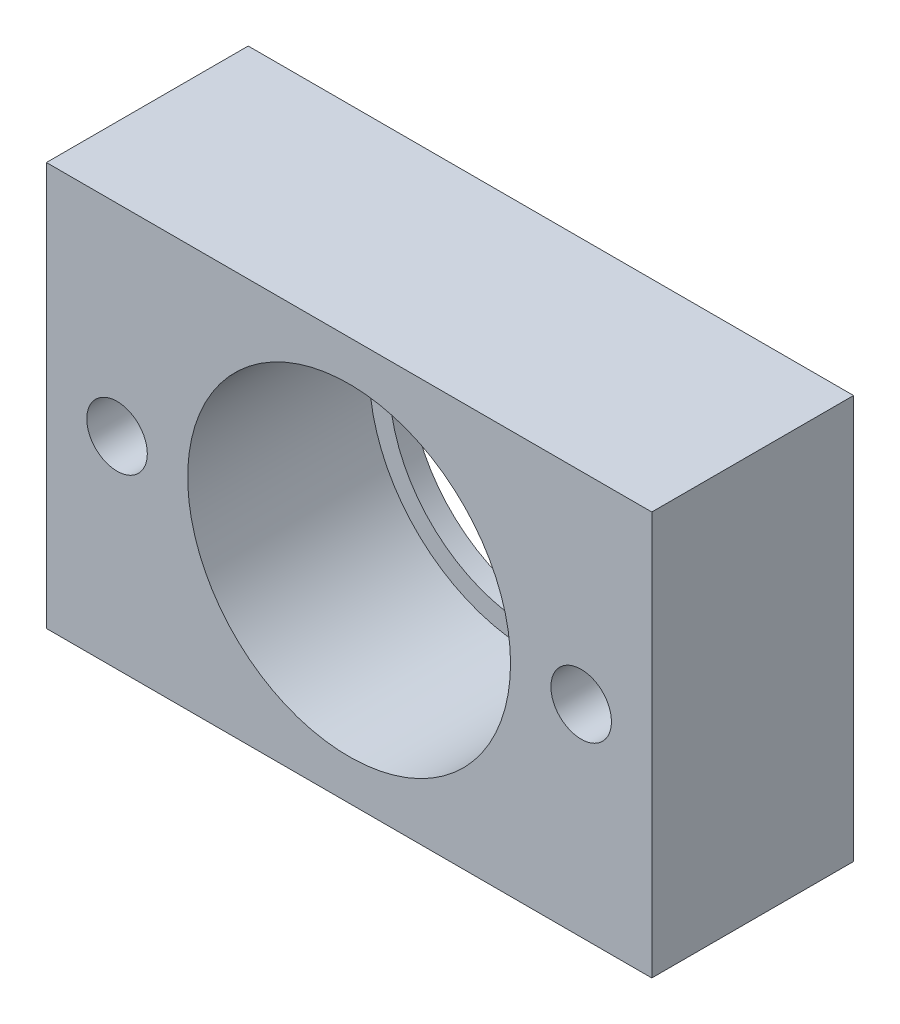
ISO-10303-21;
HEADER;
FILE_DESCRIPTION(('STEP AP214'),'2;1');
FILE_NAME('part.step','',(''),(''),'','','');
FILE_SCHEMA(('AUTOMOTIVE_DESIGN { 1 0 10303 214 1 1 1 1 }'));
ENDSEC;
DATA;
#1=APPLICATION_CONTEXT('core data for automotive mechanical design processes');
#2=APPLICATION_PROTOCOL_DEFINITION('international standard','automotive_design',2000,#1);
#3=PRODUCT_CONTEXT('',#1,'mechanical');
#4=PRODUCT('Part','Part','',(#3));
#5=PRODUCT_RELATED_PRODUCT_CATEGORY('part','',(#4));
#6=PRODUCT_DEFINITION_FORMATION('','',#4);
#7=PRODUCT_DEFINITION_CONTEXT('part definition',#1,'design');
#8=PRODUCT_DEFINITION('design','',#6,#7);
#9=PRODUCT_DEFINITION_SHAPE('','',#8);
#10=(LENGTH_UNIT() NAMED_UNIT(*) SI_UNIT(.MILLI.,.METRE.));
#11=(NAMED_UNIT(*) PLANE_ANGLE_UNIT() SI_UNIT($,.RADIAN.));
#12=(NAMED_UNIT(*) SI_UNIT($,.STERADIAN.) SOLID_ANGLE_UNIT());
#13=UNCERTAINTY_MEASURE_WITH_UNIT(LENGTH_MEASURE(1.E-05),#10,'distance_accuracy_value','');
#14=(GEOMETRIC_REPRESENTATION_CONTEXT(3) GLOBAL_UNCERTAINTY_ASSIGNED_CONTEXT((#13)) GLOBAL_UNIT_ASSIGNED_CONTEXT((#10,
#11,#12)) REPRESENTATION_CONTEXT('',''));
#15=CARTESIAN_POINT('',(0.,0.,0.));
#16=DIRECTION('',(0.,0.,1.));
#17=DIRECTION('',(1.,0.,0.));
#18=AXIS2_PLACEMENT_3D('',#15,#16,#17);
#19=CARTESIAN_POINT('',(22.2598870056497,0.,10.));
#20=DIRECTION('',(1.,0.,0.));
#21=DIRECTION('',(0.,1.,0.));
#22=AXIS2_PLACEMENT_3D('',#19,#20,#21);
#23=PLANE('',#22);
#24=DIRECTION('',(0.,-1.,0.));
#25=VECTOR('',#24,1.);
#26=CARTESIAN_POINT('',(22.2598870056497,0.,0.));
#27=LINE('',#26,#25);
#28=CARTESIAN_POINT('',(22.2598870056497,17.8813559322034,0.));
#29=VERTEX_POINT('',#28);
#30=CARTESIAN_POINT('',(22.2598870056497,-2.11864406779661,0.));
#31=VERTEX_POINT('',#30);
#32=EDGE_CURVE('E125',#29,#31,#27,.T.);
#33=ORIENTED_EDGE('',*,*,#32,.F.);
#34=DIRECTION('',(0.,0.,-1.));
#35=VECTOR('',#34,1.);
#36=CARTESIAN_POINT('',(22.2598870056497,17.8813559322034,10.));
#37=LINE('',#36,#35);
#38=CARTESIAN_POINT('',(22.2598870056497,17.8813559322034,10.));
#39=VERTEX_POINT('',#38);
#40=EDGE_CURVE('E49',#39,#29,#37,.T.);
#41=ORIENTED_EDGE('',*,*,#40,.F.);
#42=DIRECTION('',(0.,-1.,0.));
#43=VECTOR('',#42,1.);
#44=CARTESIAN_POINT('',(22.2598870056497,0.,10.));
#45=LINE('',#44,#43);
#46=CARTESIAN_POINT('',(22.2598870056497,-2.11864406779661,10.));
#47=VERTEX_POINT('',#46);
#48=EDGE_CURVE('E106',#39,#47,#45,.T.);
#49=ORIENTED_EDGE('',*,*,#48,.T.);
#50=DIRECTION('',(0.,0.,-1.));
#51=VECTOR('',#50,1.);
#52=CARTESIAN_POINT('',(22.2598870056497,-2.11864406779661,10.));
#53=LINE('',#52,#51);
#54=EDGE_CURVE('E81',#47,#31,#53,.T.);
#55=ORIENTED_EDGE('',*,*,#54,.T.);
#56=EDGE_LOOP('',(#33,#41,#49,#55));
#57=FACE_BOUND('',#56,.T.);
#58=ADVANCED_FACE('F39',(#57),#23,.T.);
#59=CARTESIAN_POINT('',(0.,17.8813559322034,10.));
#60=DIRECTION('',(0.,1.,0.));
#61=DIRECTION('',(-1.,0.,0.));
#62=AXIS2_PLACEMENT_3D('',#59,#60,#61);
#63=PLANE('',#62);
#64=DIRECTION('',(1.,0.,0.));
#65=VECTOR('',#64,1.);
#66=CARTESIAN_POINT('',(0.,17.8813559322034,0.));
#67=LINE('',#66,#65);
#68=CARTESIAN_POINT('',(-7.74011299435028,17.8813559322034,0.));
#69=VERTEX_POINT('',#68);
#70=EDGE_CURVE('E94',#69,#29,#67,.T.);
#71=ORIENTED_EDGE('',*,*,#70,.F.);
#72=DIRECTION('',(0.,0.,-1.));
#73=VECTOR('',#72,1.);
#74=CARTESIAN_POINT('',(-7.74011299435028,17.8813559322034,10.));
#75=LINE('',#74,#73);
#76=CARTESIAN_POINT('',(-7.74011299435028,17.8813559322034,10.));
#77=VERTEX_POINT('',#76);
#78=EDGE_CURVE('E88',#77,#69,#75,.T.);
#79=ORIENTED_EDGE('',*,*,#78,.F.);
#80=DIRECTION('',(1.,0.,0.));
#81=VECTOR('',#80,1.);
#82=CARTESIAN_POINT('',(0.,17.8813559322034,10.));
#83=LINE('',#82,#81);
#84=EDGE_CURVE('E92',#77,#39,#83,.T.);
#85=ORIENTED_EDGE('',*,*,#84,.T.);
#86=ORIENTED_EDGE('',*,*,#40,.T.);
#87=EDGE_LOOP('',(#71,#79,#85,#86));
#88=FACE_BOUND('',#87,.T.);
#89=ADVANCED_FACE('F90',(#88),#63,.T.);
#90=CARTESIAN_POINT('',(-7.74011299435028,0.,10.));
#91=DIRECTION('',(1.,0.,0.));
#92=DIRECTION('',(0.,0.,-1.));
#93=AXIS2_PLACEMENT_3D('',#90,#91,#92);
#94=PLANE('',#93);
#95=DIRECTION('',(0.,-1.,0.));
#96=VECTOR('',#95,1.);
#97=CARTESIAN_POINT('',(-7.74011299435028,0.,0.));
#98=LINE('',#97,#96);
#99=CARTESIAN_POINT('',(-7.74011299435028,-2.11864406779661,0.));
#100=VERTEX_POINT('',#99);
#101=EDGE_CURVE('E130',#69,#100,#98,.T.);
#102=ORIENTED_EDGE('',*,*,#101,.T.);
#103=DIRECTION('',(0.,0.,-1.));
#104=VECTOR('',#103,1.);
#105=CARTESIAN_POINT('',(-7.74011299435028,-2.11864406779661,10.));
#106=LINE('',#105,#104);
#107=CARTESIAN_POINT('',(-7.74011299435028,-2.11864406779661,10.));
#108=VERTEX_POINT('',#107);
#109=EDGE_CURVE('E98',#108,#100,#106,.T.);
#110=ORIENTED_EDGE('',*,*,#109,.F.);
#111=DIRECTION('',(0.,-1.,0.));
#112=VECTOR('',#111,1.);
#113=CARTESIAN_POINT('',(-7.74011299435028,0.,10.));
#114=LINE('',#113,#112);
#115=EDGE_CURVE('E101',#77,#108,#114,.T.);
#116=ORIENTED_EDGE('',*,*,#115,.F.);
#117=ORIENTED_EDGE('',*,*,#78,.T.);
#118=EDGE_LOOP('',(#102,#110,#116,#117));
#119=FACE_BOUND('',#118,.T.);
#120=ADVANCED_FACE('F102',(#119),#94,.F.);
#121=CARTESIAN_POINT('',(7.25988700564971,7.88135593220339,10.));
#122=DIRECTION('',(0.,0.,-1.));
#123=DIRECTION('',(-1.,0.,0.));
#124=AXIS2_PLACEMENT_3D('',#121,#122,#123);
#125=CYLINDRICAL_SURFACE('',#124,8.);
#126=CARTESIAN_POINT('',(7.25988700564971,7.88135593220339,0.999999999999999));
#127=DIRECTION('',(0.,0.,1.));
#128=DIRECTION('',(1.,0.,0.));
#129=AXIS2_PLACEMENT_3D('',#126,#127,#128);
#130=CIRCLE('',#129,8.);
#131=CARTESIAN_POINT('',(15.2598870056497,7.88135593220339,0.999999999999999));
#132=VERTEX_POINT('',#131);
#133=EDGE_CURVE('E11',#132,#132,#130,.T.);
#134=ORIENTED_EDGE('',*,*,#133,.F.);
#135=EDGE_LOOP('',(#134));
#136=FACE_BOUND('',#135,.T.);
#137=CARTESIAN_POINT('',(7.25988700564971,7.88135593220339,10.));
#138=DIRECTION('',(0.,0.,1.));
#139=DIRECTION('',(1.,0.,0.));
#140=AXIS2_PLACEMENT_3D('',#137,#138,#139);
#141=CIRCLE('',#140,8.);
#142=CARTESIAN_POINT('',(15.2598870056497,7.88135593220339,10.));
#143=VERTEX_POINT('',#142);
#144=EDGE_CURVE('E110',#143,#143,#141,.T.);
#145=ORIENTED_EDGE('',*,*,#144,.T.);
#146=EDGE_LOOP('',(#145));
#147=FACE_BOUND('',#146,.T.);
#148=ADVANCED_FACE('F166',(#136,#147),#125,.F.);
#149=CARTESIAN_POINT('',(-4.24011299435028,7.88135593220339,10.));
#150=DIRECTION('',(0.,0.,-1.));
#151=DIRECTION('',(-1.,0.,0.));
#152=AXIS2_PLACEMENT_3D('',#149,#150,#151);
#153=CYLINDRICAL_SURFACE('',#152,1.5);
#154=CARTESIAN_POINT('',(-4.24011299435028,7.88135593220339,10.));
#155=DIRECTION('',(0.,0.,1.));
#156=DIRECTION('',(1.,0.,0.));
#157=AXIS2_PLACEMENT_3D('',#154,#155,#156);
#158=CIRCLE('',#157,1.5);
#159=CARTESIAN_POINT('',(-2.74011299435028,7.88135593220339,10.));
#160=VERTEX_POINT('',#159);
#161=EDGE_CURVE('E159',#160,#160,#158,.T.);
#162=ORIENTED_EDGE('',*,*,#161,.T.);
#163=EDGE_LOOP('',(#162));
#164=FACE_BOUND('',#163,.T.);
#165=CARTESIAN_POINT('',(-4.24011299435028,7.88135593220339,0.));
#166=DIRECTION('',(0.,0.,1.));
#167=DIRECTION('',(1.,0.,0.));
#168=AXIS2_PLACEMENT_3D('',#165,#166,#167);
#169=CIRCLE('',#168,1.5);
#170=CARTESIAN_POINT('',(-2.74011299435028,7.88135593220339,0.));
#171=VERTEX_POINT('',#170);
#172=EDGE_CURVE('E120',#171,#171,#169,.T.);
#173=ORIENTED_EDGE('',*,*,#172,.F.);
#174=EDGE_LOOP('',(#173));
#175=FACE_BOUND('',#174,.T.);
#176=ADVANCED_FACE('F189',(#164,#175),#153,.F.);
#177=CARTESIAN_POINT('',(18.7598870056497,7.88135593220339,10.));
#178=DIRECTION('',(0.,0.,-1.));
#179=DIRECTION('',(-1.,0.,0.));
#180=AXIS2_PLACEMENT_3D('',#177,#178,#179);
#181=CYLINDRICAL_SURFACE('',#180,1.5);
#182=CARTESIAN_POINT('',(18.7598870056497,7.88135593220339,10.));
#183=DIRECTION('',(0.,0.,1.));
#184=DIRECTION('',(1.,0.,0.));
#185=AXIS2_PLACEMENT_3D('',#182,#183,#184);
#186=CIRCLE('',#185,1.5);
#187=CARTESIAN_POINT('',(20.2598870056497,7.88135593220339,10.));
#188=VERTEX_POINT('',#187);
#189=EDGE_CURVE('E135',#188,#188,#186,.T.);
#190=ORIENTED_EDGE('',*,*,#189,.T.);
#191=EDGE_LOOP('',(#190));
#192=FACE_BOUND('',#191,.T.);
#193=CARTESIAN_POINT('',(18.7598870056497,7.88135593220339,0.));
#194=DIRECTION('',(0.,0.,1.));
#195=DIRECTION('',(1.,0.,0.));
#196=AXIS2_PLACEMENT_3D('',#193,#194,#195);
#197=CIRCLE('',#196,1.5);
#198=CARTESIAN_POINT('',(20.2598870056497,7.88135593220339,0.));
#199=VERTEX_POINT('',#198);
#200=EDGE_CURVE('E116',#199,#199,#197,.T.);
#201=ORIENTED_EDGE('',*,*,#200,.F.);
#202=EDGE_LOOP('',(#201));
#203=FACE_BOUND('',#202,.T.);
#204=ADVANCED_FACE('F41',(#192,#203),#181,.F.);
#205=CARTESIAN_POINT('',(0.,-2.11864406779661,10.));
#206=DIRECTION('',(0.,1.,0.));
#207=DIRECTION('',(0.,0.,1.));
#208=AXIS2_PLACEMENT_3D('',#205,#206,#207);
#209=PLANE('',#208);
#210=DIRECTION('',(1.,0.,0.));
#211=VECTOR('',#210,1.);
#212=CARTESIAN_POINT('',(0.,-2.11864406779661,0.));
#213=LINE('',#212,#211);
#214=EDGE_CURVE('E74',#100,#31,#213,.T.);
#215=ORIENTED_EDGE('',*,*,#214,.T.);
#216=ORIENTED_EDGE('',*,*,#54,.F.);
#217=DIRECTION('',(1.,0.,0.));
#218=VECTOR('',#217,1.);
#219=CARTESIAN_POINT('',(0.,-2.11864406779661,10.));
#220=LINE('',#219,#218);
#221=EDGE_CURVE('E57',#108,#47,#220,.T.);
#222=ORIENTED_EDGE('',*,*,#221,.F.);
#223=ORIENTED_EDGE('',*,*,#109,.T.);
#224=EDGE_LOOP('',(#215,#216,#222,#223));
#225=FACE_BOUND('',#224,.T.);
#226=ADVANCED_FACE('F169',(#225),#209,.F.);
#227=CARTESIAN_POINT('',(0.,0.,10.));
#228=DIRECTION('',(0.,0.,1.));
#229=DIRECTION('',(1.,0.,0.));
#230=AXIS2_PLACEMENT_3D('',#227,#228,#229);
#231=PLANE('',#230);
#232=ORIENTED_EDGE('',*,*,#189,.F.);
#233=EDGE_LOOP('',(#232));
#234=FACE_BOUND('',#233,.T.);
#235=ORIENTED_EDGE('',*,*,#161,.F.);
#236=EDGE_LOOP('',(#235));
#237=FACE_BOUND('',#236,.T.);
#238=ORIENTED_EDGE('',*,*,#144,.F.);
#239=EDGE_LOOP('',(#238));
#240=FACE_BOUND('',#239,.T.);
#241=ORIENTED_EDGE('',*,*,#48,.F.);
#242=ORIENTED_EDGE('',*,*,#84,.F.);
#243=ORIENTED_EDGE('',*,*,#115,.T.);
#244=ORIENTED_EDGE('',*,*,#221,.T.);
#245=EDGE_LOOP('',(#241,#242,#243,#244));
#246=FACE_BOUND('',#245,.T.);
#247=ADVANCED_FACE('F105',(#234,#237,#240,#246),#231,.T.);
#248=CARTESIAN_POINT('',(0.,0.,0.));
#249=DIRECTION('',(0.,0.,1.));
#250=DIRECTION('',(1.,0.,0.));
#251=AXIS2_PLACEMENT_3D('',#248,#249,#250);
#252=PLANE('',#251);
#253=ORIENTED_EDGE('',*,*,#200,.T.);
#254=EDGE_LOOP('',(#253));
#255=FACE_BOUND('',#254,.T.);
#256=ORIENTED_EDGE('',*,*,#172,.T.);
#257=EDGE_LOOP('',(#256));
#258=FACE_BOUND('',#257,.T.);
#259=ORIENTED_EDGE('',*,*,#32,.T.);
#260=ORIENTED_EDGE('',*,*,#214,.F.);
#261=ORIENTED_EDGE('',*,*,#101,.F.);
#262=ORIENTED_EDGE('',*,*,#70,.T.);
#263=EDGE_LOOP('',(#259,#260,#261,#262));
#264=FACE_BOUND('',#263,.T.);
#265=CARTESIAN_POINT('',(7.25988700564971,7.88135593220339,0.));
#266=DIRECTION('',(0.,0.,1.));
#267=DIRECTION('',(1.,0.,0.));
#268=AXIS2_PLACEMENT_3D('',#265,#266,#267);
#269=CIRCLE('',#268,7.);
#270=CARTESIAN_POINT('',(14.2598870056497,7.88135593220339,0.));
#271=VERTEX_POINT('',#270);
#272=EDGE_CURVE('E148',#271,#271,#269,.T.);
#273=ORIENTED_EDGE('',*,*,#272,.T.);
#274=EDGE_LOOP('',(#273));
#275=FACE_BOUND('',#274,.T.);
#276=ADVANCED_FACE('F140',(#255,#258,#264,#275),#252,.F.);
#277=CARTESIAN_POINT('',(7.25988700564971,7.88135593220339,1.));
#278=DIRECTION('',(0.,0.,-1.));
#279=DIRECTION('',(-1.,0.,0.));
#280=AXIS2_PLACEMENT_3D('',#277,#278,#279);
#281=CYLINDRICAL_SURFACE('',#280,7.);
#282=CARTESIAN_POINT('',(7.25988700564971,7.88135593220339,1.));
#283=DIRECTION('',(0.,0.,1.));
#284=DIRECTION('',(1.,0.,0.));
#285=AXIS2_PLACEMENT_3D('',#282,#283,#284);
#286=CIRCLE('',#285,7.);
#287=CARTESIAN_POINT('',(14.2598870056497,7.88135593220339,1.));
#288=VERTEX_POINT('',#287);
#289=EDGE_CURVE('E121',#288,#288,#286,.T.);
#290=ORIENTED_EDGE('',*,*,#289,.T.);
#291=EDGE_LOOP('',(#290));
#292=FACE_BOUND('',#291,.T.);
#293=ORIENTED_EDGE('',*,*,#272,.F.);
#294=EDGE_LOOP('',(#293));
#295=FACE_BOUND('',#294,.T.);
#296=ADVANCED_FACE('F143',(#292,#295),#281,.F.);
#297=CARTESIAN_POINT('',(0.,0.,1.));
#298=DIRECTION('',(0.,0.,1.));
#299=DIRECTION('',(1.,0.,0.));
#300=AXIS2_PLACEMENT_3D('',#297,#298,#299);
#301=PLANE('',#300);
#302=ORIENTED_EDGE('',*,*,#289,.F.);
#303=EDGE_LOOP('',(#302));
#304=FACE_BOUND('',#303,.T.);
#305=ORIENTED_EDGE('',*,*,#133,.T.);
#306=EDGE_LOOP('',(#305));
#307=FACE_BOUND('',#306,.T.);
#308=ADVANCED_FACE('F238',(#304,#307),#301,.T.);
#309=CLOSED_SHELL('',(#58,#89,#120,#148,#176,#204,#226,#247,#276,#296,#308));
#310=MANIFOLD_SOLID_BREP('B2',#309);
#311=ADVANCED_BREP_SHAPE_REPRESENTATION('',(#18,#310),#14);
#312=SHAPE_DEFINITION_REPRESENTATION(#9,#311);
ENDSEC;
END-ISO-10303-21;
